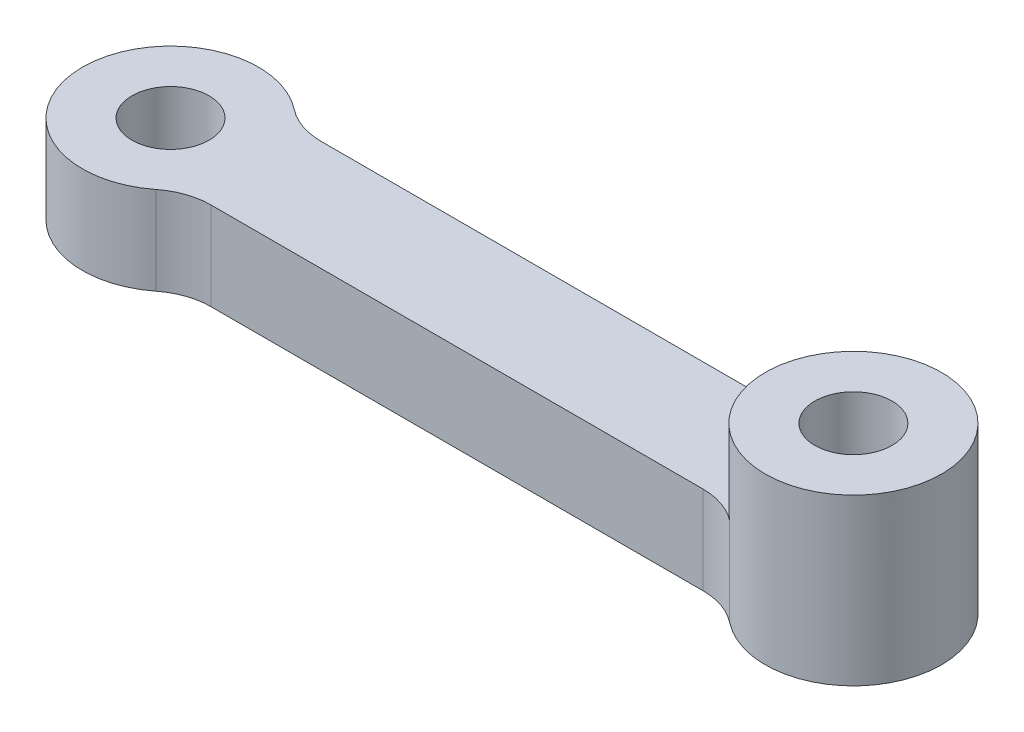
ISO-10303-21;
HEADER;
FILE_DESCRIPTION(('STEP AP214'),'2;1');
FILE_NAME('part.step','',(''),(''),'','','');
FILE_SCHEMA(('AUTOMOTIVE_DESIGN { 1 0 10303 214 1 1 1 1 }'));
ENDSEC;
DATA;
#1=APPLICATION_CONTEXT('core data for automotive mechanical design processes');
#2=APPLICATION_PROTOCOL_DEFINITION('international standard','automotive_design',2000,#1);
#3=PRODUCT_CONTEXT('',#1,'mechanical');
#4=PRODUCT('Part','Part','',(#3));
#5=PRODUCT_RELATED_PRODUCT_CATEGORY('part','',(#4));
#6=PRODUCT_DEFINITION_FORMATION('','',#4);
#7=PRODUCT_DEFINITION_CONTEXT('part definition',#1,'design');
#8=PRODUCT_DEFINITION('design','',#6,#7);
#9=PRODUCT_DEFINITION_SHAPE('','',#8);
#10=(LENGTH_UNIT() NAMED_UNIT(*) SI_UNIT(.MILLI.,.METRE.));
#11=(NAMED_UNIT(*) PLANE_ANGLE_UNIT() SI_UNIT($,.RADIAN.));
#12=(NAMED_UNIT(*) SI_UNIT($,.STERADIAN.) SOLID_ANGLE_UNIT());
#13=UNCERTAINTY_MEASURE_WITH_UNIT(LENGTH_MEASURE(1.E-05),#10,'distance_accuracy_value','');
#14=(GEOMETRIC_REPRESENTATION_CONTEXT(3) GLOBAL_UNCERTAINTY_ASSIGNED_CONTEXT((#13)) GLOBAL_UNIT_ASSIGNED_CONTEXT((#10,
#11,#12)) REPRESENTATION_CONTEXT('',''));
#15=CARTESIAN_POINT('',(0.,0.,0.));
#16=DIRECTION('',(0.,0.,1.));
#17=DIRECTION('',(1.,0.,0.));
#18=AXIS2_PLACEMENT_3D('',#15,#16,#17);
#19=CARTESIAN_POINT('',(31.,4.,0.));
#20=DIRECTION('',(0.,-1.,0.));
#21=DIRECTION('',(0.,0.,-1.));
#22=AXIS2_PLACEMENT_3D('',#19,#20,#21);
#23=PLANE('',#22);
#24=CARTESIAN_POINT('',(0.,4.,0.));
#25=DIRECTION('',(0.,-1.,0.));
#26=DIRECTION('',(0.,0.,1.));
#27=AXIS2_PLACEMENT_3D('',#24,#25,#26);
#28=CIRCLE('',#27,1.75);
#29=CARTESIAN_POINT('',(0.,4.,1.75));
#30=VERTEX_POINT('',#29);
#31=EDGE_CURVE('E204',#30,#30,#28,.T.);
#32=ORIENTED_EDGE('',*,*,#31,.T.);
#33=EDGE_LOOP('',(#32));
#34=FACE_BOUND('',#33,.T.);
#35=CARTESIAN_POINT('',(31.,4.,0.));
#36=DIRECTION('',(0.,1.,0.));
#37=DIRECTION('',(0.,0.,1.));
#38=AXIS2_PLACEMENT_3D('',#35,#36,#37);
#39=CIRCLE('',#38,4.00000000000001);
#40=CARTESIAN_POINT('',(28.525641703473,4.,-3.14285714285714));
#41=VERTEX_POINT('',#40);
#42=CARTESIAN_POINT('',(28.525641703473,4.,3.14285714285714));
#43=VERTEX_POINT('',#42);
#44=EDGE_CURVE('E87',#41,#43,#39,.T.);
#45=ORIENTED_EDGE('',*,*,#44,.F.);
#46=CARTESIAN_POINT('',(26.6698729810778,4.,-5.5));
#47=DIRECTION('',(0.,1.,0.));
#48=DIRECTION('',(0.,0.,1.));
#49=AXIS2_PLACEMENT_3D('',#46,#47,#48);
#50=CIRCLE('',#49,3.);
#51=CARTESIAN_POINT('',(26.6698729810778,4.,-2.5));
#52=VERTEX_POINT('',#51);
#53=EDGE_CURVE('E132',#52,#41,#50,.T.);
#54=ORIENTED_EDGE('',*,*,#53,.F.);
#55=DIRECTION('',(1.,0.,0.));
#56=VECTOR('',#55,1.);
#57=CARTESIAN_POINT('',(4.3301270189222,4.,-2.5));
#58=LINE('',#57,#56);
#59=CARTESIAN_POINT('',(4.3301270189222,4.,-2.5));
#60=VERTEX_POINT('',#59);
#61=EDGE_CURVE('E122',#60,#52,#58,.T.);
#62=ORIENTED_EDGE('',*,*,#61,.F.);
#63=CARTESIAN_POINT('',(4.3301270189222,4.,-5.5));
#64=DIRECTION('',(0.,1.,0.));
#65=DIRECTION('',(0.,0.,1.));
#66=AXIS2_PLACEMENT_3D('',#63,#64,#65);
#67=CIRCLE('',#66,3.);
#68=CARTESIAN_POINT('',(2.47435829652697,4.,-3.14285714285714));
#69=VERTEX_POINT('',#68);
#70=EDGE_CURVE('E105',#69,#60,#67,.T.);
#71=ORIENTED_EDGE('',*,*,#70,.F.);
#72=CARTESIAN_POINT('',(0.,4.,0.));
#73=DIRECTION('',(0.,-1.,0.));
#74=DIRECTION('',(0.,0.,-1.));
#75=AXIS2_PLACEMENT_3D('',#72,#73,#74);
#76=CIRCLE('',#75,4.);
#77=CARTESIAN_POINT('',(2.47435829652697,4.,3.14285714285714));
#78=VERTEX_POINT('',#77);
#79=EDGE_CURVE('E119',#78,#69,#76,.T.);
#80=ORIENTED_EDGE('',*,*,#79,.F.);
#81=CARTESIAN_POINT('',(4.3301270189222,4.,5.5));
#82=DIRECTION('',(0.,1.,0.));
#83=DIRECTION('',(0.,0.,1.));
#84=AXIS2_PLACEMENT_3D('',#81,#82,#83);
#85=CIRCLE('',#84,3.);
#86=CARTESIAN_POINT('',(4.3301270189222,4.,2.5));
#87=VERTEX_POINT('',#86);
#88=EDGE_CURVE('E125',#87,#78,#85,.T.);
#89=ORIENTED_EDGE('',*,*,#88,.F.);
#90=DIRECTION('',(-1.,0.,0.));
#91=VECTOR('',#90,1.);
#92=CARTESIAN_POINT('',(26.6698729810778,4.,2.5));
#93=LINE('',#92,#91);
#94=CARTESIAN_POINT('',(26.6698729810778,4.,2.5));
#95=VERTEX_POINT('',#94);
#96=EDGE_CURVE('E127',#95,#87,#93,.T.);
#97=ORIENTED_EDGE('',*,*,#96,.F.);
#98=CARTESIAN_POINT('',(26.6698729810778,4.,5.5));
#99=DIRECTION('',(0.,1.,0.));
#100=DIRECTION('',(0.,0.,1.));
#101=AXIS2_PLACEMENT_3D('',#98,#99,#100);
#102=CIRCLE('',#101,3.);
#103=EDGE_CURVE('E154',#43,#95,#102,.T.);
#104=ORIENTED_EDGE('',*,*,#103,.F.);
#105=EDGE_LOOP('',(#45,#54,#62,#71,#80,#89,#97,#104));
#106=FACE_BOUND('',#105,.T.);
#107=ADVANCED_FACE('F32',(#34,#106),#23,.F.);
#108=CARTESIAN_POINT('',(31.,4.,0.));
#109=DIRECTION('',(0.,-1.,0.));
#110=DIRECTION('',(0.,0.,-1.));
#111=AXIS2_PLACEMENT_3D('',#108,#109,#110);
#112=CYLINDRICAL_SURFACE('',#111,4.00000000000001);
#113=CARTESIAN_POINT('',(31.,0.,0.));
#114=DIRECTION('',(0.,-1.,0.));
#115=DIRECTION('',(0.,0.,-1.));
#116=AXIS2_PLACEMENT_3D('',#113,#114,#115);
#117=CIRCLE('',#116,4.00000000000001);
#118=CARTESIAN_POINT('',(28.525641703473,0.,-3.14285714285714));
#119=VERTEX_POINT('',#118);
#120=CARTESIAN_POINT('',(28.525641703473,0.,3.14285714285714));
#121=VERTEX_POINT('',#120);
#122=EDGE_CURVE('E134',#119,#121,#117,.T.);
#123=ORIENTED_EDGE('',*,*,#122,.F.);
#124=DIRECTION('',(0.,-1.,0.));
#125=VECTOR('',#124,1.);
#126=CARTESIAN_POINT('',(28.525641703473,4.,-3.14285714285714));
#127=LINE('',#126,#125);
#128=EDGE_CURVE('E11',#41,#119,#127,.T.);
#129=ORIENTED_EDGE('',*,*,#128,.F.);
#130=ORIENTED_EDGE('',*,*,#44,.T.);
#131=DIRECTION('',(0.,-1.,0.));
#132=VECTOR('',#131,1.);
#133=CARTESIAN_POINT('',(28.525641703473,4.,3.14285714285714));
#134=LINE('',#133,#132);
#135=EDGE_CURVE('E36',#43,#121,#134,.T.);
#136=ORIENTED_EDGE('',*,*,#135,.T.);
#137=EDGE_LOOP('',(#123,#129,#130,#136));
#138=FACE_BOUND('',#137,.T.);
#139=CARTESIAN_POINT('',(31.,7.5,0.));
#140=DIRECTION('',(0.,1.,0.));
#141=DIRECTION('',(0.,0.,1.));
#142=AXIS2_PLACEMENT_3D('',#139,#140,#141);
#143=CIRCLE('',#142,4.00000000000001);
#144=CARTESIAN_POINT('',(31.,7.5,4.00000000000001));
#145=VERTEX_POINT('',#144);
#146=EDGE_CURVE('E301',#145,#145,#143,.T.);
#147=ORIENTED_EDGE('',*,*,#146,.F.);
#148=EDGE_LOOP('',(#147));
#149=FACE_BOUND('',#148,.T.);
#150=ADVANCED_FACE('F34',(#138,#149),#112,.T.);
#151=CARTESIAN_POINT('',(26.6698729810778,4.,-5.5));
#152=DIRECTION('',(0.,-1.,0.));
#153=DIRECTION('',(0.,0.,-1.));
#154=AXIS2_PLACEMENT_3D('',#151,#152,#153);
#155=CYLINDRICAL_SURFACE('',#154,3.);
#156=CARTESIAN_POINT('',(26.6698729810778,0.,-5.5));
#157=DIRECTION('',(0.,1.,0.));
#158=DIRECTION('',(0.,0.,1.));
#159=AXIS2_PLACEMENT_3D('',#156,#157,#158);
#160=CIRCLE('',#159,3.);
#161=CARTESIAN_POINT('',(26.6698729810778,0.,-2.5));
#162=VERTEX_POINT('',#161);
#163=EDGE_CURVE('E152',#162,#119,#160,.T.);
#164=ORIENTED_EDGE('',*,*,#163,.F.);
#165=DIRECTION('',(0.,-1.,0.));
#166=VECTOR('',#165,1.);
#167=CARTESIAN_POINT('',(26.6698729810778,4.,-2.5));
#168=LINE('',#167,#166);
#169=EDGE_CURVE('E42',#52,#162,#168,.T.);
#170=ORIENTED_EDGE('',*,*,#169,.F.);
#171=ORIENTED_EDGE('',*,*,#53,.T.);
#172=ORIENTED_EDGE('',*,*,#128,.T.);
#173=EDGE_LOOP('',(#164,#170,#171,#172));
#174=FACE_BOUND('',#173,.T.);
#175=ADVANCED_FACE('F170',(#174),#155,.F.);
#176=CARTESIAN_POINT('',(4.3301270189222,4.,-2.5));
#177=DIRECTION('',(0.,0.,-1.));
#178=DIRECTION('',(-1.,0.,0.));
#179=AXIS2_PLACEMENT_3D('',#176,#177,#178);
#180=PLANE('',#179);
#181=DIRECTION('',(1.,0.,0.));
#182=VECTOR('',#181,1.);
#183=CARTESIAN_POINT('',(4.3301270189222,0.,-2.5));
#184=LINE('',#183,#182);
#185=CARTESIAN_POINT('',(4.3301270189222,0.,-2.5));
#186=VERTEX_POINT('',#185);
#187=EDGE_CURVE('E150',#186,#162,#184,.T.);
#188=ORIENTED_EDGE('',*,*,#187,.F.);
#189=DIRECTION('',(0.,-1.,0.));
#190=VECTOR('',#189,1.);
#191=CARTESIAN_POINT('',(4.3301270189222,4.,-2.5));
#192=LINE('',#191,#190);
#193=EDGE_CURVE('E112',#60,#186,#192,.T.);
#194=ORIENTED_EDGE('',*,*,#193,.F.);
#195=ORIENTED_EDGE('',*,*,#61,.T.);
#196=ORIENTED_EDGE('',*,*,#169,.T.);
#197=EDGE_LOOP('',(#188,#194,#195,#196));
#198=FACE_BOUND('',#197,.T.);
#199=ADVANCED_FACE('F172',(#198),#180,.T.);
#200=CARTESIAN_POINT('',(4.3301270189222,4.,-5.5));
#201=DIRECTION('',(0.,-1.,0.));
#202=DIRECTION('',(0.,0.,-1.));
#203=AXIS2_PLACEMENT_3D('',#200,#201,#202);
#204=CYLINDRICAL_SURFACE('',#203,3.);
#205=CARTESIAN_POINT('',(4.3301270189222,0.,-5.5));
#206=DIRECTION('',(0.,1.,0.));
#207=DIRECTION('',(0.,0.,1.));
#208=AXIS2_PLACEMENT_3D('',#205,#206,#207);
#209=CIRCLE('',#208,3.);
#210=CARTESIAN_POINT('',(2.47435829652697,0.,-3.14285714285714));
#211=VERTEX_POINT('',#210);
#212=EDGE_CURVE('E107',#211,#186,#209,.T.);
#213=ORIENTED_EDGE('',*,*,#212,.F.);
#214=DIRECTION('',(0.,-1.,0.));
#215=VECTOR('',#214,1.);
#216=CARTESIAN_POINT('',(2.47435829652697,4.,-3.14285714285714));
#217=LINE('',#216,#215);
#218=EDGE_CURVE('E102',#69,#211,#217,.T.);
#219=ORIENTED_EDGE('',*,*,#218,.F.);
#220=ORIENTED_EDGE('',*,*,#70,.T.);
#221=ORIENTED_EDGE('',*,*,#193,.T.);
#222=EDGE_LOOP('',(#213,#219,#220,#221));
#223=FACE_BOUND('',#222,.T.);
#224=ADVANCED_FACE('F104',(#223),#204,.F.);
#225=CARTESIAN_POINT('',(0.,4.,0.));
#226=DIRECTION('',(0.,-1.,0.));
#227=DIRECTION('',(0.,0.,-1.));
#228=AXIS2_PLACEMENT_3D('',#225,#226,#227);
#229=CYLINDRICAL_SURFACE('',#228,4.);
#230=CARTESIAN_POINT('',(0.,0.,0.));
#231=DIRECTION('',(0.,-1.,0.));
#232=DIRECTION('',(0.,0.,-1.));
#233=AXIS2_PLACEMENT_3D('',#230,#231,#232);
#234=CIRCLE('',#233,4.);
#235=CARTESIAN_POINT('',(2.47435829652697,0.,3.14285714285714));
#236=VERTEX_POINT('',#235);
#237=EDGE_CURVE('E147',#236,#211,#234,.T.);
#238=ORIENTED_EDGE('',*,*,#237,.F.);
#239=DIRECTION('',(0.,-1.,0.));
#240=VECTOR('',#239,1.);
#241=CARTESIAN_POINT('',(2.47435829652697,4.,3.14285714285714));
#242=LINE('',#241,#240);
#243=EDGE_CURVE('E113',#78,#236,#242,.T.);
#244=ORIENTED_EDGE('',*,*,#243,.F.);
#245=ORIENTED_EDGE('',*,*,#79,.T.);
#246=ORIENTED_EDGE('',*,*,#218,.T.);
#247=EDGE_LOOP('',(#238,#244,#245,#246));
#248=FACE_BOUND('',#247,.T.);
#249=ADVANCED_FACE('F124',(#248),#229,.T.);
#250=CARTESIAN_POINT('',(4.3301270189222,4.,5.5));
#251=DIRECTION('',(0.,-1.,0.));
#252=DIRECTION('',(0.,0.,-1.));
#253=AXIS2_PLACEMENT_3D('',#250,#251,#252);
#254=CYLINDRICAL_SURFACE('',#253,3.);
#255=CARTESIAN_POINT('',(4.3301270189222,0.,5.5));
#256=DIRECTION('',(0.,1.,0.));
#257=DIRECTION('',(0.,0.,1.));
#258=AXIS2_PLACEMENT_3D('',#255,#256,#257);
#259=CIRCLE('',#258,3.);
#260=CARTESIAN_POINT('',(4.3301270189222,0.,2.5));
#261=VERTEX_POINT('',#260);
#262=EDGE_CURVE('E144',#261,#236,#259,.T.);
#263=ORIENTED_EDGE('',*,*,#262,.F.);
#264=DIRECTION('',(0.,-1.,0.));
#265=VECTOR('',#264,1.);
#266=CARTESIAN_POINT('',(4.3301270189222,4.,2.5));
#267=LINE('',#266,#265);
#268=EDGE_CURVE('E159',#87,#261,#267,.T.);
#269=ORIENTED_EDGE('',*,*,#268,.F.);
#270=ORIENTED_EDGE('',*,*,#88,.T.);
#271=ORIENTED_EDGE('',*,*,#243,.T.);
#272=EDGE_LOOP('',(#263,#269,#270,#271));
#273=FACE_BOUND('',#272,.T.);
#274=ADVANCED_FACE('F214',(#273),#254,.F.);
#275=CARTESIAN_POINT('',(26.6698729810778,4.,2.5));
#276=DIRECTION('',(0.,0.,1.));
#277=DIRECTION('',(1.,0.,0.));
#278=AXIS2_PLACEMENT_3D('',#275,#276,#277);
#279=PLANE('',#278);
#280=DIRECTION('',(-1.,0.,0.));
#281=VECTOR('',#280,1.);
#282=CARTESIAN_POINT('',(26.6698729810778,0.,2.5));
#283=LINE('',#282,#281);
#284=CARTESIAN_POINT('',(26.6698729810778,0.,2.5));
#285=VERTEX_POINT('',#284);
#286=EDGE_CURVE('E141',#285,#261,#283,.T.);
#287=ORIENTED_EDGE('',*,*,#286,.F.);
#288=DIRECTION('',(0.,-1.,0.));
#289=VECTOR('',#288,1.);
#290=CARTESIAN_POINT('',(26.6698729810778,4.,2.5));
#291=LINE('',#290,#289);
#292=EDGE_CURVE('E160',#95,#285,#291,.T.);
#293=ORIENTED_EDGE('',*,*,#292,.F.);
#294=ORIENTED_EDGE('',*,*,#96,.T.);
#295=ORIENTED_EDGE('',*,*,#268,.T.);
#296=EDGE_LOOP('',(#287,#293,#294,#295));
#297=FACE_BOUND('',#296,.T.);
#298=ADVANCED_FACE('F197',(#297),#279,.T.);
#299=CARTESIAN_POINT('',(26.6698729810778,4.,5.5));
#300=DIRECTION('',(0.,-1.,0.));
#301=DIRECTION('',(0.,0.,-1.));
#302=AXIS2_PLACEMENT_3D('',#299,#300,#301);
#303=CYLINDRICAL_SURFACE('',#302,3.);
#304=CARTESIAN_POINT('',(26.6698729810778,0.,5.5));
#305=DIRECTION('',(0.,1.,0.));
#306=DIRECTION('',(0.,0.,1.));
#307=AXIS2_PLACEMENT_3D('',#304,#305,#306);
#308=CIRCLE('',#307,3.);
#309=EDGE_CURVE('E137',#121,#285,#308,.T.);
#310=ORIENTED_EDGE('',*,*,#309,.F.);
#311=ORIENTED_EDGE('',*,*,#135,.F.);
#312=ORIENTED_EDGE('',*,*,#103,.T.);
#313=ORIENTED_EDGE('',*,*,#292,.T.);
#314=EDGE_LOOP('',(#310,#311,#312,#313));
#315=FACE_BOUND('',#314,.T.);
#316=ADVANCED_FACE('F167',(#315),#303,.F.);
#317=CARTESIAN_POINT('',(31.,0.,0.));
#318=DIRECTION('',(0.,-1.,0.));
#319=DIRECTION('',(0.,0.,-1.));
#320=AXIS2_PLACEMENT_3D('',#317,#318,#319);
#321=PLANE('',#320);
#322=CARTESIAN_POINT('',(0.,0.,0.));
#323=DIRECTION('',(0.,-1.,0.));
#324=DIRECTION('',(0.,0.,1.));
#325=AXIS2_PLACEMENT_3D('',#322,#323,#324);
#326=CIRCLE('',#325,1.75);
#327=CARTESIAN_POINT('',(0.,0.,1.75));
#328=VERTEX_POINT('',#327);
#329=EDGE_CURVE('E201',#328,#328,#326,.T.);
#330=ORIENTED_EDGE('',*,*,#329,.F.);
#331=EDGE_LOOP('',(#330));
#332=FACE_BOUND('',#331,.T.);
#333=CARTESIAN_POINT('',(31.,0.,0.));
#334=DIRECTION('',(0.,-1.,0.));
#335=DIRECTION('',(0.,0.,1.));
#336=AXIS2_PLACEMENT_3D('',#333,#334,#335);
#337=CIRCLE('',#336,1.75);
#338=CARTESIAN_POINT('',(31.,0.,1.75));
#339=VERTEX_POINT('',#338);
#340=EDGE_CURVE('E138',#339,#339,#337,.T.);
#341=ORIENTED_EDGE('',*,*,#340,.F.);
#342=EDGE_LOOP('',(#341));
#343=FACE_BOUND('',#342,.T.);
#344=ORIENTED_EDGE('',*,*,#122,.T.);
#345=ORIENTED_EDGE('',*,*,#309,.T.);
#346=ORIENTED_EDGE('',*,*,#286,.T.);
#347=ORIENTED_EDGE('',*,*,#262,.T.);
#348=ORIENTED_EDGE('',*,*,#237,.T.);
#349=ORIENTED_EDGE('',*,*,#212,.T.);
#350=ORIENTED_EDGE('',*,*,#187,.T.);
#351=ORIENTED_EDGE('',*,*,#163,.T.);
#352=EDGE_LOOP('',(#344,#345,#346,#347,#348,#349,#350,#351));
#353=FACE_BOUND('',#352,.T.);
#354=ADVANCED_FACE('F169',(#332,#343,#353),#321,.T.);
#355=CARTESIAN_POINT('',(31.,4.,0.));
#356=DIRECTION('',(0.,-1.,0.));
#357=DIRECTION('',(0.,0.,-1.));
#358=AXIS2_PLACEMENT_3D('',#355,#356,#357);
#359=CYLINDRICAL_SURFACE('',#358,1.75);
#360=ORIENTED_EDGE('',*,*,#340,.T.);
#361=EDGE_LOOP('',(#360));
#362=FACE_BOUND('',#361,.T.);
#363=CARTESIAN_POINT('',(31.,7.5,0.));
#364=DIRECTION('',(0.,1.,0.));
#365=DIRECTION('',(0.,0.,1.));
#366=AXIS2_PLACEMENT_3D('',#363,#364,#365);
#367=CIRCLE('',#366,1.75);
#368=CARTESIAN_POINT('',(31.,7.5,1.75));
#369=VERTEX_POINT('',#368);
#370=EDGE_CURVE('E304',#369,#369,#367,.T.);
#371=ORIENTED_EDGE('',*,*,#370,.T.);
#372=EDGE_LOOP('',(#371));
#373=FACE_BOUND('',#372,.T.);
#374=ADVANCED_FACE('F187',(#362,#373),#359,.F.);
#375=CARTESIAN_POINT('',(0.,4.,0.));
#376=DIRECTION('',(0.,-1.,0.));
#377=DIRECTION('',(0.,0.,-1.));
#378=AXIS2_PLACEMENT_3D('',#375,#376,#377);
#379=CYLINDRICAL_SURFACE('',#378,1.75);
#380=ORIENTED_EDGE('',*,*,#31,.F.);
#381=EDGE_LOOP('',(#380));
#382=FACE_BOUND('',#381,.T.);
#383=ORIENTED_EDGE('',*,*,#329,.T.);
#384=EDGE_LOOP('',(#383));
#385=FACE_BOUND('',#384,.T.);
#386=ADVANCED_FACE('F195',(#382,#385),#379,.F.);
#387=CARTESIAN_POINT('',(31.,7.5,0.));
#388=DIRECTION('',(0.,1.,0.));
#389=DIRECTION('',(0.,0.,1.));
#390=AXIS2_PLACEMENT_3D('',#387,#388,#389);
#391=PLANE('',#390);
#392=ORIENTED_EDGE('',*,*,#146,.T.);
#393=EDGE_LOOP('',(#392));
#394=FACE_BOUND('',#393,.T.);
#395=ORIENTED_EDGE('',*,*,#370,.F.);
#396=EDGE_LOOP('',(#395));
#397=FACE_BOUND('',#396,.T.);
#398=ADVANCED_FACE('F257',(#394,#397),#391,.T.);
#399=CLOSED_SHELL('',(#107,#150,#175,#199,#224,#249,#274,#298,#316,#354,#374,#386,#398));
#400=MANIFOLD_SOLID_BREP('B2',#399);
#401=ADVANCED_BREP_SHAPE_REPRESENTATION('',(#18,#400),#14);
#402=SHAPE_DEFINITION_REPRESENTATION(#9,#401);
ENDSEC;
END-ISO-10303-21;
